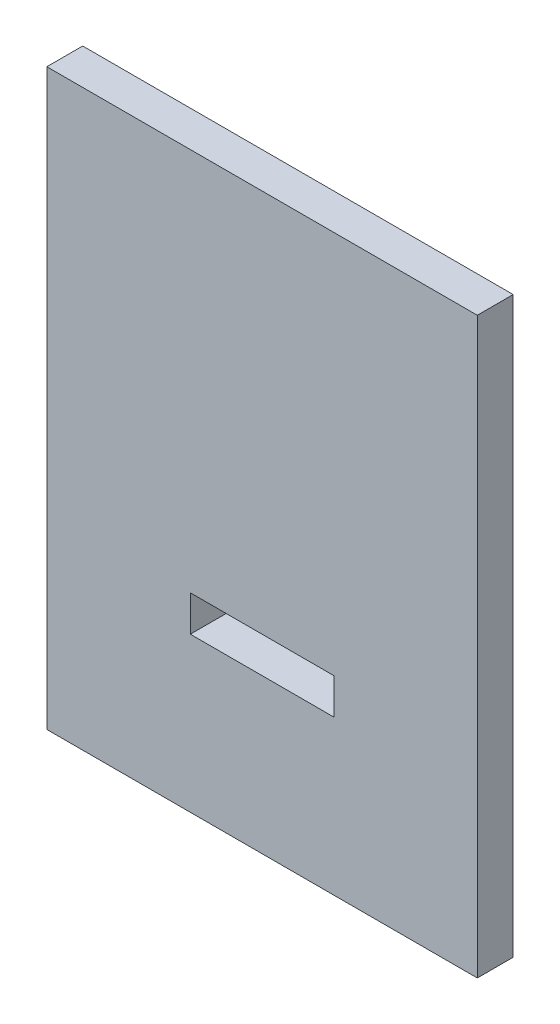
ISO-10303-21;
HEADER;
FILE_DESCRIPTION(('STEP AP214'),'2;1');
FILE_NAME('part.step','',(''),(''),'','','');
FILE_SCHEMA(('AUTOMOTIVE_DESIGN { 1 0 10303 214 1 1 1 1 }'));
ENDSEC;
DATA;
#1=APPLICATION_CONTEXT('core data for automotive mechanical design processes');
#2=APPLICATION_PROTOCOL_DEFINITION('international standard','automotive_design',2000,#1);
#3=PRODUCT_CONTEXT('',#1,'mechanical');
#4=PRODUCT('Part','Part','',(#3));
#5=PRODUCT_RELATED_PRODUCT_CATEGORY('part','',(#4));
#6=PRODUCT_DEFINITION_FORMATION('','',#4);
#7=PRODUCT_DEFINITION_CONTEXT('part definition',#1,'design');
#8=PRODUCT_DEFINITION('design','',#6,#7);
#9=PRODUCT_DEFINITION_SHAPE('','',#8);
#10=(LENGTH_UNIT() NAMED_UNIT(*) SI_UNIT(.MILLI.,.METRE.));
#11=(NAMED_UNIT(*) PLANE_ANGLE_UNIT() SI_UNIT($,.RADIAN.));
#12=(NAMED_UNIT(*) SI_UNIT($,.STERADIAN.) SOLID_ANGLE_UNIT());
#13=UNCERTAINTY_MEASURE_WITH_UNIT(LENGTH_MEASURE(1.E-05),#10,'distance_accuracy_value','');
#14=(GEOMETRIC_REPRESENTATION_CONTEXT(3) GLOBAL_UNCERTAINTY_ASSIGNED_CONTEXT((#13)) GLOBAL_UNIT_ASSIGNED_CONTEXT((#10,
#11,#12)) REPRESENTATION_CONTEXT('',''));
#15=CARTESIAN_POINT('',(0.,0.,0.));
#16=DIRECTION('',(0.,0.,1.));
#17=DIRECTION('',(1.,0.,0.));
#18=AXIS2_PLACEMENT_3D('',#15,#16,#17);
#19=CARTESIAN_POINT('',(0.,0.,0.125));
#20=DIRECTION('',(0.,0.,-1.));
#21=DIRECTION('',(-1.,0.,0.));
#22=AXIS2_PLACEMENT_3D('',#19,#20,#21);
#23=PLANE('',#22);
#24=DIRECTION('',(0.,-1.,0.));
#25=VECTOR('',#24,1.);
#26=CARTESIAN_POINT('',(0.,0.,0.125));
#27=LINE('',#26,#25);
#28=CARTESIAN_POINT('',(0.,4.,0.125));
#29=VERTEX_POINT('',#28);
#30=CARTESIAN_POINT('',(0.,0.,0.125));
#31=VERTEX_POINT('',#30);
#32=EDGE_CURVE('E134',#29,#31,#27,.T.);
#33=ORIENTED_EDGE('',*,*,#32,.T.);
#34=DIRECTION('',(1.,0.,0.));
#35=VECTOR('',#34,1.);
#36=CARTESIAN_POINT('',(0.,0.,0.125));
#37=LINE('',#36,#35);
#38=CARTESIAN_POINT('',(3.,0.,0.125));
#39=VERTEX_POINT('',#38);
#40=EDGE_CURVE('E137',#31,#39,#37,.T.);
#41=ORIENTED_EDGE('',*,*,#40,.T.);
#42=DIRECTION('',(0.,1.,0.));
#43=VECTOR('',#42,1.);
#44=CARTESIAN_POINT('',(3.,0.,0.125));
#45=LINE('',#44,#43);
#46=CARTESIAN_POINT('',(3.,4.,0.125));
#47=VERTEX_POINT('',#46);
#48=EDGE_CURVE('E140',#39,#47,#45,.T.);
#49=ORIENTED_EDGE('',*,*,#48,.T.);
#50=DIRECTION('',(-1.,0.,0.));
#51=VECTOR('',#50,1.);
#52=CARTESIAN_POINT('',(0.,4.,0.125));
#53=LINE('',#52,#51);
#54=EDGE_CURVE('E142',#47,#29,#53,.T.);
#55=ORIENTED_EDGE('',*,*,#54,.T.);
#56=EDGE_LOOP('',(#33,#41,#49,#55));
#57=FACE_BOUND('',#56,.T.);
#58=DIRECTION('',(0.,-1.,0.));
#59=VECTOR('',#58,1.);
#60=CARTESIAN_POINT('',(1.,1.325,0.125));
#61=LINE('',#60,#59);
#62=CARTESIAN_POINT('',(1.,1.325,0.125));
#63=VERTEX_POINT('',#62);
#64=CARTESIAN_POINT('',(1.,1.075,0.125));
#65=VERTEX_POINT('',#64);
#66=EDGE_CURVE('E98',#63,#65,#61,.T.);
#67=ORIENTED_EDGE('',*,*,#66,.F.);
#68=DIRECTION('',(-1.,0.,0.));
#69=VECTOR('',#68,1.);
#70=CARTESIAN_POINT('',(1.,1.325,0.125));
#71=LINE('',#70,#69);
#72=CARTESIAN_POINT('',(2.,1.325,0.125));
#73=VERTEX_POINT('',#72);
#74=EDGE_CURVE('E120',#73,#63,#71,.T.);
#75=ORIENTED_EDGE('',*,*,#74,.F.);
#76=DIRECTION('',(0.,1.,0.));
#77=VECTOR('',#76,1.);
#78=CARTESIAN_POINT('',(2.,1.325,0.125));
#79=LINE('',#78,#77);
#80=CARTESIAN_POINT('',(2.,1.075,0.125));
#81=VERTEX_POINT('',#80);
#82=EDGE_CURVE('E118',#81,#73,#79,.T.);
#83=ORIENTED_EDGE('',*,*,#82,.F.);
#84=DIRECTION('',(1.,0.,0.));
#85=VECTOR('',#84,1.);
#86=CARTESIAN_POINT('',(1.,1.075,0.125));
#87=LINE('',#86,#85);
#88=EDGE_CURVE('E106',#65,#81,#87,.T.);
#89=ORIENTED_EDGE('',*,*,#88,.F.);
#90=EDGE_LOOP('',(#67,#75,#83,#89));
#91=FACE_BOUND('',#90,.T.);
#92=ADVANCED_FACE('F33',(#57,#91),#23,.F.);
#93=CARTESIAN_POINT('',(0.,0.,-0.125));
#94=DIRECTION('',(0.,0.,-1.));
#95=DIRECTION('',(-1.,0.,0.));
#96=AXIS2_PLACEMENT_3D('',#93,#94,#95);
#97=PLANE('',#96);
#98=DIRECTION('',(0.,-1.,0.));
#99=VECTOR('',#98,1.);
#100=CARTESIAN_POINT('',(0.,0.,-0.125));
#101=LINE('',#100,#99);
#102=CARTESIAN_POINT('',(0.,4.,-0.125));
#103=VERTEX_POINT('',#102);
#104=CARTESIAN_POINT('',(0.,0.,-0.125));
#105=VERTEX_POINT('',#104);
#106=EDGE_CURVE('E114',#103,#105,#101,.T.);
#107=ORIENTED_EDGE('',*,*,#106,.F.);
#108=DIRECTION('',(-1.,0.,0.));
#109=VECTOR('',#108,1.);
#110=CARTESIAN_POINT('',(0.,4.,-0.125));
#111=LINE('',#110,#109);
#112=CARTESIAN_POINT('',(3.,4.,-0.125));
#113=VERTEX_POINT('',#112);
#114=EDGE_CURVE('E138',#113,#103,#111,.T.);
#115=ORIENTED_EDGE('',*,*,#114,.F.);
#116=DIRECTION('',(0.,1.,0.));
#117=VECTOR('',#116,1.);
#118=CARTESIAN_POINT('',(3.,0.,-0.125));
#119=LINE('',#118,#117);
#120=CARTESIAN_POINT('',(3.,0.,-0.125));
#121=VERTEX_POINT('',#120);
#122=EDGE_CURVE('E149',#121,#113,#119,.T.);
#123=ORIENTED_EDGE('',*,*,#122,.F.);
#124=DIRECTION('',(1.,0.,0.));
#125=VECTOR('',#124,1.);
#126=CARTESIAN_POINT('',(0.,0.,-0.125));
#127=LINE('',#126,#125);
#128=EDGE_CURVE('E147',#105,#121,#127,.T.);
#129=ORIENTED_EDGE('',*,*,#128,.F.);
#130=EDGE_LOOP('',(#107,#115,#123,#129));
#131=FACE_BOUND('',#130,.T.);
#132=DIRECTION('',(-1.,0.,0.));
#133=VECTOR('',#132,1.);
#134=CARTESIAN_POINT('',(1.,1.325,-0.125));
#135=LINE('',#134,#133);
#136=CARTESIAN_POINT('',(2.,1.325,-0.125));
#137=VERTEX_POINT('',#136);
#138=CARTESIAN_POINT('',(1.,1.325,-0.125));
#139=VERTEX_POINT('',#138);
#140=EDGE_CURVE('E107',#137,#139,#135,.T.);
#141=ORIENTED_EDGE('',*,*,#140,.T.);
#142=DIRECTION('',(0.,-1.,0.));
#143=VECTOR('',#142,1.);
#144=CARTESIAN_POINT('',(1.,1.325,-0.125));
#145=LINE('',#144,#143);
#146=CARTESIAN_POINT('',(1.,1.075,-0.125));
#147=VERTEX_POINT('',#146);
#148=EDGE_CURVE('E56',#139,#147,#145,.T.);
#149=ORIENTED_EDGE('',*,*,#148,.T.);
#150=DIRECTION('',(1.,0.,0.));
#151=VECTOR('',#150,1.);
#152=CARTESIAN_POINT('',(1.,1.075,-0.125));
#153=LINE('',#152,#151);
#154=CARTESIAN_POINT('',(2.,1.075,-0.125));
#155=VERTEX_POINT('',#154);
#156=EDGE_CURVE('E113',#147,#155,#153,.T.);
#157=ORIENTED_EDGE('',*,*,#156,.T.);
#158=DIRECTION('',(0.,1.,0.));
#159=VECTOR('',#158,1.);
#160=CARTESIAN_POINT('',(2.,1.325,-0.125));
#161=LINE('',#160,#159);
#162=EDGE_CURVE('E126',#155,#137,#161,.T.);
#163=ORIENTED_EDGE('',*,*,#162,.T.);
#164=EDGE_LOOP('',(#141,#149,#157,#163));
#165=FACE_BOUND('',#164,.T.);
#166=ADVANCED_FACE('F167',(#131,#165),#97,.T.);
#167=CARTESIAN_POINT('',(0.,0.,0.125));
#168=DIRECTION('',(1.,0.,0.));
#169=DIRECTION('',(0.,0.,-1.));
#170=AXIS2_PLACEMENT_3D('',#167,#168,#169);
#171=PLANE('',#170);
#172=ORIENTED_EDGE('',*,*,#106,.T.);
#173=DIRECTION('',(0.,0.,-1.));
#174=VECTOR('',#173,1.);
#175=CARTESIAN_POINT('',(0.,0.,0.125));
#176=LINE('',#175,#174);
#177=EDGE_CURVE('E11',#31,#105,#176,.T.);
#178=ORIENTED_EDGE('',*,*,#177,.F.);
#179=ORIENTED_EDGE('',*,*,#32,.F.);
#180=DIRECTION('',(0.,0.,-1.));
#181=VECTOR('',#180,1.);
#182=CARTESIAN_POINT('',(0.,4.,0.125));
#183=LINE('',#182,#181);
#184=EDGE_CURVE('E144',#29,#103,#183,.T.);
#185=ORIENTED_EDGE('',*,*,#184,.T.);
#186=EDGE_LOOP('',(#172,#178,#179,#185));
#187=FACE_BOUND('',#186,.T.);
#188=ADVANCED_FACE('F35',(#187),#171,.F.);
#189=CARTESIAN_POINT('',(0.,0.,0.125));
#190=DIRECTION('',(0.,1.,0.));
#191=DIRECTION('',(0.,0.,1.));
#192=AXIS2_PLACEMENT_3D('',#189,#190,#191);
#193=PLANE('',#192);
#194=ORIENTED_EDGE('',*,*,#128,.T.);
#195=DIRECTION('',(0.,0.,-1.));
#196=VECTOR('',#195,1.);
#197=CARTESIAN_POINT('',(3.,0.,0.125));
#198=LINE('',#197,#196);
#199=EDGE_CURVE('E41',#39,#121,#198,.T.);
#200=ORIENTED_EDGE('',*,*,#199,.F.);
#201=ORIENTED_EDGE('',*,*,#40,.F.);
#202=ORIENTED_EDGE('',*,*,#177,.T.);
#203=EDGE_LOOP('',(#194,#200,#201,#202));
#204=FACE_BOUND('',#203,.T.);
#205=ADVANCED_FACE('F177',(#204),#193,.F.);
#206=CARTESIAN_POINT('',(3.,0.,0.125));
#207=DIRECTION('',(-1.,0.,0.));
#208=DIRECTION('',(0.,0.,1.));
#209=AXIS2_PLACEMENT_3D('',#206,#207,#208);
#210=PLANE('',#209);
#211=ORIENTED_EDGE('',*,*,#122,.T.);
#212=DIRECTION('',(0.,0.,-1.));
#213=VECTOR('',#212,1.);
#214=CARTESIAN_POINT('',(3.,4.,0.125));
#215=LINE('',#214,#213);
#216=EDGE_CURVE('E154',#47,#113,#215,.T.);
#217=ORIENTED_EDGE('',*,*,#216,.F.);
#218=ORIENTED_EDGE('',*,*,#48,.F.);
#219=ORIENTED_EDGE('',*,*,#199,.T.);
#220=EDGE_LOOP('',(#211,#217,#218,#219));
#221=FACE_BOUND('',#220,.T.);
#222=ADVANCED_FACE('F161',(#221),#210,.F.);
#223=CARTESIAN_POINT('',(0.,4.,0.125));
#224=DIRECTION('',(0.,-1.,0.));
#225=DIRECTION('',(0.,0.,-1.));
#226=AXIS2_PLACEMENT_3D('',#223,#224,#225);
#227=PLANE('',#226);
#228=ORIENTED_EDGE('',*,*,#114,.T.);
#229=ORIENTED_EDGE('',*,*,#184,.F.);
#230=ORIENTED_EDGE('',*,*,#54,.F.);
#231=ORIENTED_EDGE('',*,*,#216,.T.);
#232=EDGE_LOOP('',(#228,#229,#230,#231));
#233=FACE_BOUND('',#232,.T.);
#234=ADVANCED_FACE('F171',(#233),#227,.F.);
#235=CARTESIAN_POINT('',(1.,1.325,0.125));
#236=DIRECTION('',(1.,0.,0.));
#237=DIRECTION('',(0.,0.,-1.));
#238=AXIS2_PLACEMENT_3D('',#235,#236,#237);
#239=PLANE('',#238);
#240=ORIENTED_EDGE('',*,*,#148,.F.);
#241=DIRECTION('',(0.,0.,-1.));
#242=VECTOR('',#241,1.);
#243=CARTESIAN_POINT('',(1.,1.325,0.125));
#244=LINE('',#243,#242);
#245=EDGE_CURVE('E102',#63,#139,#244,.T.);
#246=ORIENTED_EDGE('',*,*,#245,.F.);
#247=ORIENTED_EDGE('',*,*,#66,.T.);
#248=DIRECTION('',(0.,0.,-1.));
#249=VECTOR('',#248,1.);
#250=CARTESIAN_POINT('',(1.,1.075,0.125));
#251=LINE('',#250,#249);
#252=EDGE_CURVE('E101',#65,#147,#251,.T.);
#253=ORIENTED_EDGE('',*,*,#252,.T.);
#254=EDGE_LOOP('',(#240,#246,#247,#253));
#255=FACE_BOUND('',#254,.T.);
#256=ADVANCED_FACE('F100',(#255),#239,.T.);
#257=CARTESIAN_POINT('',(1.,1.075,0.125));
#258=DIRECTION('',(0.,1.,0.));
#259=DIRECTION('',(0.,0.,1.));
#260=AXIS2_PLACEMENT_3D('',#257,#258,#259);
#261=PLANE('',#260);
#262=ORIENTED_EDGE('',*,*,#156,.F.);
#263=ORIENTED_EDGE('',*,*,#252,.F.);
#264=ORIENTED_EDGE('',*,*,#88,.T.);
#265=DIRECTION('',(0.,0.,-1.));
#266=VECTOR('',#265,1.);
#267=CARTESIAN_POINT('',(2.,1.075,0.125));
#268=LINE('',#267,#266);
#269=EDGE_CURVE('E115',#81,#155,#268,.T.);
#270=ORIENTED_EDGE('',*,*,#269,.T.);
#271=EDGE_LOOP('',(#262,#263,#264,#270));
#272=FACE_BOUND('',#271,.T.);
#273=ADVANCED_FACE('F110',(#272),#261,.T.);
#274=CARTESIAN_POINT('',(2.,1.325,0.125));
#275=DIRECTION('',(-1.,0.,0.));
#276=DIRECTION('',(0.,0.,1.));
#277=AXIS2_PLACEMENT_3D('',#274,#275,#276);
#278=PLANE('',#277);
#279=ORIENTED_EDGE('',*,*,#162,.F.);
#280=ORIENTED_EDGE('',*,*,#269,.F.);
#281=ORIENTED_EDGE('',*,*,#82,.T.);
#282=DIRECTION('',(0.,0.,-1.));
#283=VECTOR('',#282,1.);
#284=CARTESIAN_POINT('',(2.,1.325,0.125));
#285=LINE('',#284,#283);
#286=EDGE_CURVE('E48',#73,#137,#285,.T.);
#287=ORIENTED_EDGE('',*,*,#286,.T.);
#288=EDGE_LOOP('',(#279,#280,#281,#287));
#289=FACE_BOUND('',#288,.T.);
#290=ADVANCED_FACE('F200',(#289),#278,.T.);
#291=CARTESIAN_POINT('',(1.,1.325,0.125));
#292=DIRECTION('',(0.,-1.,0.));
#293=DIRECTION('',(0.,0.,-1.));
#294=AXIS2_PLACEMENT_3D('',#291,#292,#293);
#295=PLANE('',#294);
#296=ORIENTED_EDGE('',*,*,#140,.F.);
#297=ORIENTED_EDGE('',*,*,#286,.F.);
#298=ORIENTED_EDGE('',*,*,#74,.T.);
#299=ORIENTED_EDGE('',*,*,#245,.T.);
#300=EDGE_LOOP('',(#296,#297,#298,#299));
#301=FACE_BOUND('',#300,.T.);
#302=ADVANCED_FACE('F204',(#301),#295,.T.);
#303=CLOSED_SHELL('',(#92,#166,#188,#205,#222,#234,#256,#273,#290,#302));
#304=MANIFOLD_SOLID_BREP('B2',#303);
#305=ADVANCED_BREP_SHAPE_REPRESENTATION('',(#18,#304),#14);
#306=SHAPE_DEFINITION_REPRESENTATION(#9,#305);
ENDSEC;
END-ISO-10303-21;
